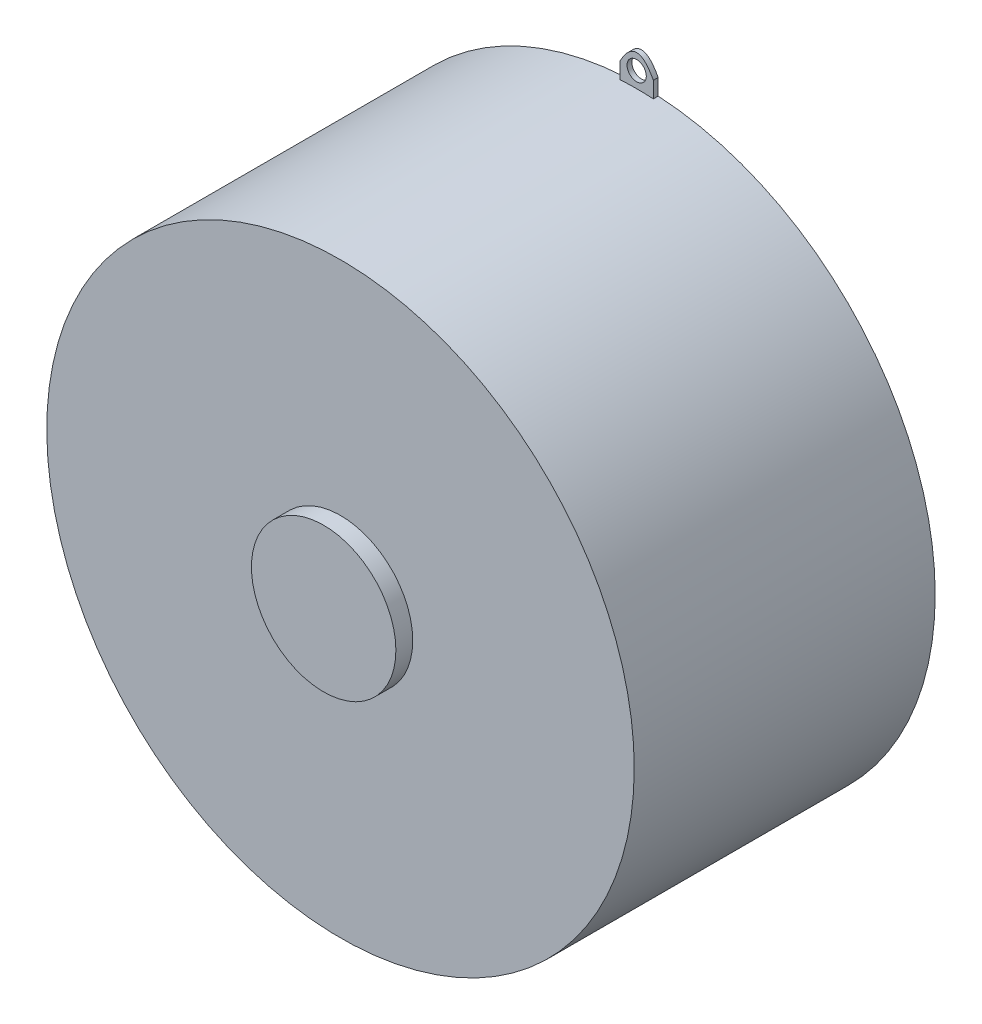
ISO-10303-21;
HEADER;
FILE_DESCRIPTION(('STEP AP214'),'2;1');
FILE_NAME('part.step','',(''),(''),'','','');
FILE_SCHEMA(('AUTOMOTIVE_DESIGN { 1 0 10303 214 1 1 1 1 }'));
ENDSEC;
DATA;
#1=APPLICATION_CONTEXT('core data for automotive mechanical design processes');
#2=APPLICATION_PROTOCOL_DEFINITION('international standard','automotive_design',2000,#1);
#3=PRODUCT_CONTEXT('',#1,'mechanical');
#4=PRODUCT('Part','Part','',(#3));
#5=PRODUCT_RELATED_PRODUCT_CATEGORY('part','',(#4));
#6=PRODUCT_DEFINITION_FORMATION('','',#4);
#7=PRODUCT_DEFINITION_CONTEXT('part definition',#1,'design');
#8=PRODUCT_DEFINITION('design','',#6,#7);
#9=PRODUCT_DEFINITION_SHAPE('','',#8);
#10=(LENGTH_UNIT() NAMED_UNIT(*) SI_UNIT(.MILLI.,.METRE.));
#11=(NAMED_UNIT(*) PLANE_ANGLE_UNIT() SI_UNIT($,.RADIAN.));
#12=(NAMED_UNIT(*) SI_UNIT($,.STERADIAN.) SOLID_ANGLE_UNIT());
#13=UNCERTAINTY_MEASURE_WITH_UNIT(LENGTH_MEASURE(1.E-05),#10,'distance_accuracy_value','');
#14=(GEOMETRIC_REPRESENTATION_CONTEXT(3) GLOBAL_UNCERTAINTY_ASSIGNED_CONTEXT((#13)) GLOBAL_UNIT_ASSIGNED_CONTEXT((#10,
#11,#12)) REPRESENTATION_CONTEXT('',''));
#15=CARTESIAN_POINT('',(0.,0.,0.));
#16=DIRECTION('',(0.,0.,1.));
#17=DIRECTION('',(1.,0.,0.));
#18=AXIS2_PLACEMENT_3D('',#15,#16,#17);
#19=CARTESIAN_POINT('',(0.,0.,-5.3));
#20=DIRECTION('',(0.,0.,1.));
#21=DIRECTION('',(1.,0.,0.));
#22=AXIS2_PLACEMENT_3D('',#19,#20,#21);
#23=CYLINDRICAL_SURFACE('',#22,1.);
#24=CARTESIAN_POINT('',(0.,0.,-5.3));
#25=DIRECTION('',(0.,0.,-1.));
#26=DIRECTION('',(-1.,0.,0.));
#27=AXIS2_PLACEMENT_3D('',#24,#25,#26);
#28=CIRCLE('',#27,1.);
#29=CARTESIAN_POINT('',(-1.,0.,-5.3));
#30=VERTEX_POINT('',#29);
#31=EDGE_CURVE('E364',#30,#30,#28,.T.);
#32=ORIENTED_EDGE('',*,*,#31,.F.);
#33=EDGE_LOOP('',(#32));
#34=FACE_BOUND('',#33,.T.);
#35=CARTESIAN_POINT('',(0.,0.,-0.5));
#36=DIRECTION('',(0.,0.,-1.));
#37=DIRECTION('',(-1.,0.,0.));
#38=AXIS2_PLACEMENT_3D('',#35,#36,#37);
#39=CIRCLE('',#38,1.);
#40=CARTESIAN_POINT('',(-1.,0.,-0.5));
#41=VERTEX_POINT('',#40);
#42=EDGE_CURVE('E343',#41,#41,#39,.T.);
#43=ORIENTED_EDGE('',*,*,#42,.T.);
#44=EDGE_LOOP('',(#43));
#45=FACE_BOUND('',#44,.T.);
#46=CARTESIAN_POINT('',(0.324436742180061,-0.945907395215615,-2.19590364640662));
#47=CARTESIAN_POINT('',(0.324434225291573,-0.945909362151226,-2.17447589168283));
#48=CARTESIAN_POINT('',(0.322648665590669,-0.946526639994775,-2.15301782994374));
#49=CARTESIAN_POINT('',(0.315578505603582,-0.948906311365887,-2.1107172627641));
#50=CARTESIAN_POINT('',(0.310284964177607,-0.950671630805546,-2.08987647279784));
#51=CARTESIAN_POINT('',(0.296449088398732,-0.955075937265124,-2.04949408259734));
#52=CARTESIAN_POINT('',(0.287918995351223,-0.957711627551271,-2.02994790907413));
#53=CARTESIAN_POINT('',(0.267910050193361,-0.963499988270369,-1.99252808333759));
#54=CARTESIAN_POINT('',(0.256431841875879,-0.966652545778463,-1.97465406712904));
#55=CARTESIAN_POINT('',(0.230176924244251,-0.973247538781266,-1.9400532632731));
#56=CARTESIAN_POINT('',(0.215260009092982,-0.976696528394831,-1.92343406477273));
#57=CARTESIAN_POINT('',(0.18288693073741,-0.983272607626951,-1.89279952432207));
#58=CARTESIAN_POINT('',(0.165429883826096,-0.986399584568711,-1.87878509244521));
#59=CARTESIAN_POINT('',(0.12765714171568,-0.992008991616168,-1.85322377374083));
#60=CARTESIAN_POINT('',(0.107255853530934,-0.994461135192959,-1.84179601272979));
#61=CARTESIAN_POINT('',(0.0647177226048224,-0.998131419742484,-1.82253580939339));
#62=CARTESIAN_POINT('',(0.0425815903498055,-0.999350063065721,-1.81470190415963));
#63=CARTESIAN_POINT('',(-0.00164276109157981,-1.00023119786886,-1.80323574112415));
#64=CARTESIAN_POINT('',(-0.0236814202658569,-0.999966168681,-1.7994184358874));
#65=CARTESIAN_POINT('',(-0.0680151973612102,-0.99793065819225,-1.795497984973));
#66=CARTESIAN_POINT('',(-0.0903102165083141,-0.996160738730243,-1.79539345378343));
#67=CARTESIAN_POINT('',(-0.133193507210785,-0.991311916278786,-1.79880007865559));
#68=CARTESIAN_POINT('',(-0.153807299261474,-0.988312132928374,-1.80210844790468));
#69=CARTESIAN_POINT('',(-0.194062868497015,-0.981202108313626,-1.81190204628088));
#70=CARTESIAN_POINT('',(-0.213704574275582,-0.977091785615516,-1.81838750840664));
#71=CARTESIAN_POINT('',(-0.25182605533489,-0.967974107852494,-1.83443077285999));
#72=CARTESIAN_POINT('',(-0.270283871832028,-0.962954173378863,-1.8440333824013));
#73=CARTESIAN_POINT('',(-0.305323894544439,-0.952424561924679,-1.86599636527846));
#74=CARTESIAN_POINT('',(-0.321905455026847,-0.946914717494576,-1.87835768372827));
#75=CARTESIAN_POINT('',(-0.353899939190523,-0.93544769479271,-1.90643300725181));
#76=CARTESIAN_POINT('',(-0.369164675150867,-0.929484896178391,-1.92231384064005));
#77=CARTESIAN_POINT('',(-0.396893970189738,-0.917987472314669,-1.95650090457785));
#78=CARTESIAN_POINT('',(-0.409357612791649,-0.91245298759048,-1.97480792583508));
#79=CARTESIAN_POINT('',(-0.431487995755532,-0.902203675514238,-2.01398615298607));
#80=CARTESIAN_POINT('',(-0.441065777171563,-0.897516420248011,-2.03491518681403));
#81=CARTESIAN_POINT('',(-0.456612609234126,-0.889708667769292,-2.07834503765161));
#82=CARTESIAN_POINT('',(-0.462584003305925,-0.886587153364646,-2.10084482336072));
#83=CARTESIAN_POINT('',(-0.470425847447674,-0.882450063793875,-2.14530888124353));
#84=CARTESIAN_POINT('',(-0.472524512329182,-0.881317499904934,-2.16722191652592));
#85=CARTESIAN_POINT('',(-0.473234044444228,-0.880936951688668,-2.21111748899978));
#86=CARTESIAN_POINT('',(-0.4718459692832,-0.881688395899855,-2.23310000309674));
#87=CARTESIAN_POINT('',(-0.465823952006189,-0.884883211085994,-2.27519433102709));
#88=CARTESIAN_POINT('',(-0.461379363269549,-0.887227790031893,-2.29534138542617));
#89=CARTESIAN_POINT('',(-0.44960301998729,-0.893252790526944,-2.33456098477123));
#90=CARTESIAN_POINT('',(-0.442270625305328,-0.89693350824214,-2.35363329040678));
#91=CARTESIAN_POINT('',(-0.424574965405367,-0.905447927778751,-2.39102442115635));
#92=CARTESIAN_POINT('',(-0.414100860022007,-0.910322329152668,-2.40928133667843));
#93=CARTESIAN_POINT('',(-0.39050372845111,-0.920691449068172,-2.44380096933211));
#94=CARTESIAN_POINT('',(-0.377379623548089,-0.926186419817572,-2.46006287002042));
#95=CARTESIAN_POINT('',(-0.347681275977476,-0.93775776188096,-2.49137923326675));
#96=CARTESIAN_POINT('',(-0.330923809489772,-0.943847099861078,-2.50625581864967));
#97=CARTESIAN_POINT('',(-0.295008246667299,-0.955681541944862,-2.53293981417677));
#98=CARTESIAN_POINT('',(-0.275850052811056,-0.961426632050595,-2.54474709958104));
#99=CARTESIAN_POINT('',(-0.235580745201013,-0.972077580290542,-2.56491366142693));
#100=CARTESIAN_POINT('',(-0.214470112903131,-0.976983644476256,-2.57327378515065));
#101=CARTESIAN_POINT('',(-0.170882142153246,-0.985541168330321,-2.58621358879627));
#102=CARTESIAN_POINT('',(-0.148405552509789,-0.989193308218302,-2.59079532028978));
#103=CARTESIAN_POINT('',(-0.104296784974277,-0.994778393762521,-2.59580459684676));
#104=CARTESIAN_POINT('',(-0.0827051860539979,-0.996807956534549,-2.59648366381623));
#105=CARTESIAN_POINT('',(-0.0396128686870716,-0.999448112601287,-2.5943325606254));
#106=CARTESIAN_POINT('',(-0.0181121369817497,-1.00005892058548,-2.5915029215106));
#107=CARTESIAN_POINT('',(0.0235023867120378,-0.999933910851502,-2.58259443777847));
#108=CARTESIAN_POINT('',(0.0436384941896606,-0.999238871927031,-2.57661804483813));
#109=CARTESIAN_POINT('',(0.08270398565154,-0.996766533367678,-2.56169336860866));
#110=CARTESIAN_POINT('',(0.101633146271985,-0.994989034045589,-2.55274453711653));
#111=CARTESIAN_POINT('',(0.138649980779317,-0.990524674477262,-2.53168341294824));
#112=CARTESIAN_POINT('',(0.15666348799326,-0.987801095406952,-2.51944878544706));
#113=CARTESIAN_POINT('',(0.190494812490118,-0.981838748533181,-2.49234630334236));
#114=CARTESIAN_POINT('',(0.206311716023672,-0.978599767526407,-2.47747735872631));
#115=CARTESIAN_POINT('',(0.236287639554858,-0.971812158647412,-2.44444081497042));
#116=CARTESIAN_POINT('',(0.250283404699097,-0.968256774845,-2.42612598996322));
#117=CARTESIAN_POINT('',(0.274977094275787,-0.961536325115072,-2.38731509960095));
#118=CARTESIAN_POINT('',(0.285674631310193,-0.958371305064458,-2.36681877839522));
#119=CARTESIAN_POINT('',(0.302575156206335,-0.95316285627702,-2.32609597293323));
#120=CARTESIAN_POINT('',(0.309095507527843,-0.951044227552477,-2.30601056474851));
#121=CARTESIAN_POINT('',(0.318805533287902,-0.947834461880353,-2.26500692145924));
#122=CARTESIAN_POINT('',(0.322004488700386,-0.946740462654865,-2.24409117751841));
#123=CARTESIAN_POINT('',(0.324119744664414,-0.946015858645798,-2.21402863185632));
#124=CARTESIAN_POINT('',(0.324437806972435,-0.945906563085765,-2.20496885129011));
#125=CARTESIAN_POINT('',(0.324436742180061,-0.945907395215615,-2.19590364640662));
#126=B_SPLINE_CURVE_WITH_KNOTS('',3,(#46,#47,#48,#49,#50,#51,#52,#53,#54,#55,#56,#57,#58,#59,
#60,#61,#62,#63,#64,#65,#66,#67,#68,#69,#70,#71,#72,#73,#74,#75,#76,#77,#78,#79,#80,#81,#82,#83,
#84,#85,#86,#87,#88,#89,#90,#91,#92,#93,#94,#95,#96,#97,#98,#99,#100,#101,#102,#103,#104,#105,
#106,#107,#108,#109,#110,#111,#112,#113,#114,#115,#116,#117,#118,#119,#120,#121,#122,#123,#124,
#125),.UNSPECIFIED.,.T.,.F.,(4,2,2,2,2,2,2,2,2,2,2,2,2,2,2,2,2,2,2,2,2,2,2,2,2,2,2,2,2,2,2,2,2,
2,2,2,2,2,2,4),(0.,0.064255093801459,0.128674594066265,0.192852836762955,0.257017076473185,
0.324509353174941,0.392025166701806,0.462203921075704,0.532354083210266,0.599108181056326,
0.665837367725471,0.728817941550643,0.791803134877486,0.855737075605713,0.919692953361314,
0.987847562673598,1.05602443881418,1.12612730570592,1.19618457070729,1.26196259191828,
1.32772066360885,1.38973382647279,1.4517607434612,1.51630272565158,1.58087103362173,
1.65020803938491,1.71954786264432,1.7888706326094,1.85815573723058,1.92292060734514,
1.98767567644063,2.0504421186552,2.11322014323702,2.17877276163733,2.24435256763983,
2.31399226519831,2.38364013927254,2.44703313864727,2.51024851834461,2.537432215266),.UNSPECIFIED.);
#127=CARTESIAN_POINT('',(0.324436742180061,-0.945907395215615,-2.19590364640662));
#128=VERTEX_POINT('',#127);
#129=EDGE_CURVE('E41',#128,#128,#126,.T.);
#130=ORIENTED_EDGE('',*,*,#129,.F.);
#131=EDGE_LOOP('',(#130));
#132=FACE_BOUND('',#131,.T.);
#133=ADVANCED_FACE('F37',(#34,#45,#132),#23,.T.);
#134=CARTESIAN_POINT('',(0.,0.,12.5));
#135=DIRECTION('',(0.,0.,-1.));
#136=DIRECTION('',(-1.,0.,0.));
#137=AXIS2_PLACEMENT_3D('',#134,#135,#136);
#138=CYLINDRICAL_SURFACE('',#137,12.2);
#139=CARTESIAN_POINT('',(0.,0.,12.5));
#140=DIRECTION('',(0.,0.,1.));
#141=DIRECTION('',(1.,0.,0.));
#142=AXIS2_PLACEMENT_3D('',#139,#140,#141);
#143=CIRCLE('',#142,12.2);
#144=CARTESIAN_POINT('',(12.2,0.,12.5));
#145=VERTEX_POINT('',#144);
#146=EDGE_CURVE('E393',#145,#145,#143,.T.);
#147=ORIENTED_EDGE('',*,*,#146,.F.);
#148=EDGE_LOOP('',(#147));
#149=FACE_BOUND('',#148,.T.);
#150=DIRECTION('',(0.,0.,-1.));
#151=VECTOR('',#150,1.);
#152=CARTESIAN_POINT('',(0.694469448137106,-12.1802180680645,0.2));
#153=LINE('',#152,#151);
#154=CARTESIAN_POINT('',(0.694469448137106,-12.1802180680645,0.200000000000001));
#155=VERTEX_POINT('',#154);
#156=CARTESIAN_POINT('',(0.694469448137106,-12.1802180680645,0.));
#157=VERTEX_POINT('',#156);
#158=EDGE_CURVE('E157',#155,#157,#153,.T.);
#159=ORIENTED_EDGE('',*,*,#158,.T.);
#160=CARTESIAN_POINT('',(0.,0.,0.));
#161=DIRECTION('',(0.,0.,1.));
#162=DIRECTION('',(1.,0.,0.));
#163=AXIS2_PLACEMENT_3D('',#160,#161,#162);
#164=CIRCLE('',#163,12.2);
#165=CARTESIAN_POINT('',(0.694469448137106,12.1802180680645,0.));
#166=VERTEX_POINT('',#165);
#167=EDGE_CURVE('E390',#157,#166,#164,.T.);
#168=ORIENTED_EDGE('',*,*,#167,.T.);
#169=DIRECTION('',(0.,0.,-1.));
#170=VECTOR('',#169,1.);
#171=CARTESIAN_POINT('',(0.694469448137106,12.1802180680645,0.2));
#172=LINE('',#171,#170);
#173=CARTESIAN_POINT('',(0.694469448137106,12.1802180680645,0.200000000000001));
#174=VERTEX_POINT('',#173);
#175=EDGE_CURVE('E344',#174,#166,#172,.T.);
#176=ORIENTED_EDGE('',*,*,#175,.F.);
#177=CARTESIAN_POINT('',(0.,0.,0.2));
#178=DIRECTION('',(0.,0.,-1.));
#179=DIRECTION('',(-1.,0.,0.));
#180=AXIS2_PLACEMENT_3D('',#177,#178,#179);
#181=CIRCLE('',#180,12.2);
#182=CARTESIAN_POINT('',(-0.694469448136626,12.1802180680645,0.200000000000001));
#183=VERTEX_POINT('',#182);
#184=EDGE_CURVE('E338',#183,#174,#181,.T.);
#185=ORIENTED_EDGE('',*,*,#184,.F.);
#186=DIRECTION('',(0.,0.,-1.));
#187=VECTOR('',#186,1.);
#188=CARTESIAN_POINT('',(-0.694469448136626,12.1802180680645,0.2));
#189=LINE('',#188,#187);
#190=CARTESIAN_POINT('',(-0.694469448136626,12.1802180680645,0.));
#191=VERTEX_POINT('',#190);
#192=EDGE_CURVE('E341',#183,#191,#189,.T.);
#193=ORIENTED_EDGE('',*,*,#192,.T.);
#194=CARTESIAN_POINT('',(-0.694469448136626,-12.1802180680645,0.));
#195=VERTEX_POINT('',#194);
#196=EDGE_CURVE('E303',#191,#195,#164,.T.);
#197=ORIENTED_EDGE('',*,*,#196,.T.);
#198=DIRECTION('',(0.,0.,-1.));
#199=VECTOR('',#198,1.);
#200=CARTESIAN_POINT('',(-0.694469448136626,-12.1802180680645,0.2));
#201=LINE('',#200,#199);
#202=CARTESIAN_POINT('',(-0.694469448136626,-12.1802180680645,0.200000000000001));
#203=VERTEX_POINT('',#202);
#204=EDGE_CURVE('E59',#203,#195,#201,.T.);
#205=ORIENTED_EDGE('',*,*,#204,.F.);
#206=CARTESIAN_POINT('',(0.,0.,0.2));
#207=DIRECTION('',(0.,0.,-1.));
#208=DIRECTION('',(-1.,0.,0.));
#209=AXIS2_PLACEMENT_3D('',#206,#207,#208);
#210=CIRCLE('',#209,12.2);
#211=EDGE_CURVE('E63',#155,#203,#210,.T.);
#212=ORIENTED_EDGE('',*,*,#211,.F.);
#213=EDGE_LOOP('',(#159,#168,#176,#185,#193,#197,#205,#212));
#214=FACE_BOUND('',#213,.T.);
#215=ADVANCED_FACE('F39',(#149,#214),#138,.T.);
#216=CARTESIAN_POINT('',(0.,0.,-1.));
#217=DIRECTION('',(0.,0.,1.));
#218=DIRECTION('',(1.,0.,0.));
#219=AXIS2_PLACEMENT_3D('',#216,#217,#218);
#220=CYLINDRICAL_SURFACE('',#219,3.25);
#221=CARTESIAN_POINT('',(0.,0.,0.));
#222=DIRECTION('',(0.,0.,-1.));
#223=DIRECTION('',(-1.,0.,0.));
#224=AXIS2_PLACEMENT_3D('',#221,#222,#223);
#225=CIRCLE('',#224,3.25);
#226=CARTESIAN_POINT('',(-3.25,0.,0.));
#227=VERTEX_POINT('',#226);
#228=EDGE_CURVE('E11',#227,#227,#225,.T.);
#229=ORIENTED_EDGE('',*,*,#228,.T.);
#230=EDGE_LOOP('',(#229));
#231=FACE_BOUND('',#230,.T.);
#232=CARTESIAN_POINT('',(0.,0.,-0.5));
#233=DIRECTION('',(0.,0.,-1.));
#234=DIRECTION('',(-1.,0.,0.));
#235=AXIS2_PLACEMENT_3D('',#232,#233,#234);
#236=CIRCLE('',#235,3.25);
#237=CARTESIAN_POINT('',(-3.25,0.,-0.5));
#238=VERTEX_POINT('',#237);
#239=EDGE_CURVE('E347',#238,#238,#236,.T.);
#240=ORIENTED_EDGE('',*,*,#239,.F.);
#241=EDGE_LOOP('',(#240));
#242=FACE_BOUND('',#241,.T.);
#243=ADVANCED_FACE('F255',(#231,#242),#220,.T.);
#244=CARTESIAN_POINT('',(0.,0.,12.5));
#245=DIRECTION('',(0.,0.,1.));
#246=DIRECTION('',(1.,0.,0.));
#247=AXIS2_PLACEMENT_3D('',#244,#245,#246);
#248=PLANE('',#247);
#249=CARTESIAN_POINT('',(0.,0.,12.5));
#250=DIRECTION('',(0.,0.,1.));
#251=DIRECTION('',(1.,0.,0.));
#252=AXIS2_PLACEMENT_3D('',#249,#250,#251);
#253=CIRCLE('',#252,3.);
#254=CARTESIAN_POINT('',(3.,0.,12.5));
#255=VERTEX_POINT('',#254);
#256=EDGE_CURVE('E51',#255,#255,#253,.T.);
#257=ORIENTED_EDGE('',*,*,#256,.F.);
#258=EDGE_LOOP('',(#257));
#259=FACE_BOUND('',#258,.T.);
#260=ORIENTED_EDGE('',*,*,#146,.T.);
#261=EDGE_LOOP('',(#260));
#262=FACE_BOUND('',#261,.T.);
#263=ADVANCED_FACE('F258',(#259,#262),#248,.T.);
#264=CARTESIAN_POINT('',(0.,0.,0.));
#265=DIRECTION('',(0.,0.,1.));
#266=DIRECTION('',(1.,0.,0.));
#267=AXIS2_PLACEMENT_3D('',#264,#265,#266);
#268=PLANE('',#267);
#269=CARTESIAN_POINT('',(0.,8.25,0.));
#270=DIRECTION('',(0.,0.,-1.));
#271=DIRECTION('',(-1.,0.,0.));
#272=AXIS2_PLACEMENT_3D('',#269,#270,#271);
#273=CIRCLE('',#272,0.85);
#274=CARTESIAN_POINT('',(-0.85,8.25,0.));
#275=VERTEX_POINT('',#274);
#276=EDGE_CURVE('E278',#275,#275,#273,.T.);
#277=ORIENTED_EDGE('',*,*,#276,.F.);
#278=EDGE_LOOP('',(#277));
#279=FACE_BOUND('',#278,.T.);
#280=CARTESIAN_POINT('',(-7.14470958122185,4.12500000000041,0.));
#281=DIRECTION('',(0.,0.,-1.));
#282=DIRECTION('',(-1.,0.,0.));
#283=AXIS2_PLACEMENT_3D('',#280,#281,#282);
#284=CIRCLE('',#283,0.850000000000126);
#285=CARTESIAN_POINT('',(-7.99470958122198,4.12500000000041,0.));
#286=VERTEX_POINT('',#285);
#287=EDGE_CURVE('E282',#286,#286,#284,.T.);
#288=ORIENTED_EDGE('',*,*,#287,.F.);
#289=EDGE_LOOP('',(#288));
#290=FACE_BOUND('',#289,.T.);
#291=CARTESIAN_POINT('',(-7.14470958122232,-4.12499999999959,0.));
#292=DIRECTION('',(0.,0.,-1.));
#293=DIRECTION('',(-1.,0.,0.));
#294=AXIS2_PLACEMENT_3D('',#291,#292,#293);
#295=CIRCLE('',#294,0.850000000000591);
#296=CARTESIAN_POINT('',(-7.99470958122291,-4.12499999999959,0.));
#297=VERTEX_POINT('',#296);
#298=EDGE_CURVE('E286',#297,#297,#295,.T.);
#299=ORIENTED_EDGE('',*,*,#298,.F.);
#300=EDGE_LOOP('',(#299));
#301=FACE_BOUND('',#300,.T.);
#302=CARTESIAN_POINT('',(-9.35895743984739E-13,-8.25,0.));
#303=DIRECTION('',(0.,0.,-1.));
#304=DIRECTION('',(-1.,0.,0.));
#305=AXIS2_PLACEMENT_3D('',#302,#303,#304);
#306=CIRCLE('',#305,0.85000000000095);
#307=CARTESIAN_POINT('',(-0.850000000001886,-8.25,0.));
#308=VERTEX_POINT('',#307);
#309=EDGE_CURVE('E290',#308,#308,#306,.T.);
#310=ORIENTED_EDGE('',*,*,#309,.F.);
#311=EDGE_LOOP('',(#310));
#312=FACE_BOUND('',#311,.T.);
#313=CARTESIAN_POINT('',(7.14470958122092,-4.12500000000041,0.));
#314=DIRECTION('',(0.,0.,-1.));
#315=DIRECTION('',(-1.,0.,0.));
#316=AXIS2_PLACEMENT_3D('',#313,#314,#315);
#317=CIRCLE('',#316,0.850000000000865);
#318=CARTESIAN_POINT('',(6.29470958122005,-4.12500000000041,0.));
#319=VERTEX_POINT('',#318);
#320=EDGE_CURVE('E294',#319,#319,#317,.T.);
#321=ORIENTED_EDGE('',*,*,#320,.F.);
#322=EDGE_LOOP('',(#321));
#323=FACE_BOUND('',#322,.T.);
#324=CARTESIAN_POINT('',(7.14470958122139,4.12499999999959,0.));
#325=DIRECTION('',(0.,0.,-1.));
#326=DIRECTION('',(-1.,0.,0.));
#327=AXIS2_PLACEMENT_3D('',#324,#325,#326);
#328=CIRCLE('',#327,0.85000000000044);
#329=CARTESIAN_POINT('',(6.29470958122095,4.12499999999959,0.));
#330=VERTEX_POINT('',#329);
#331=EDGE_CURVE('E298',#330,#330,#328,.T.);
#332=ORIENTED_EDGE('',*,*,#331,.F.);
#333=EDGE_LOOP('',(#332));
#334=FACE_BOUND('',#333,.T.);
#335=ORIENTED_EDGE('',*,*,#228,.F.);
#336=EDGE_LOOP('',(#335));
#337=FACE_BOUND('',#336,.T.);
#338=ORIENTED_EDGE('',*,*,#196,.F.);
#339=DIRECTION('',(0.,-1.,0.));
#340=VECTOR('',#339,1.);
#341=CARTESIAN_POINT('',(-0.694469448136626,0.,0.));
#342=LINE('',#341,#340);
#343=CARTESIAN_POINT('',(-0.694469448136626,12.849999999997,0.));
#344=VERTEX_POINT('',#343);
#345=EDGE_CURVE('E342',#344,#191,#342,.T.);
#346=ORIENTED_EDGE('',*,*,#345,.F.);
#347=CARTESIAN_POINT('',(-0.694469448136626,12.849999999997,0.));
#348=CARTESIAN_POINT('',(2.402863064771E-13,14.149999999997,0.));
#349=CARTESIAN_POINT('',(0.694469448137106,12.849999999997,0.));
#350=B_SPLINE_CURVE_WITH_KNOTS('',2,(#347,#348,#349),.UNSPECIFIED.,.F.,.F.,(3,3),(0.,1.),.UNSPECIFIED.);
#351=CARTESIAN_POINT('',(0.694469448137106,12.849999999997,0.));
#352=VERTEX_POINT('',#351);
#353=EDGE_CURVE('E401',#344,#352,#350,.T.);
#354=ORIENTED_EDGE('',*,*,#353,.T.);
#355=DIRECTION('',(0.,-1.,0.));
#356=VECTOR('',#355,1.);
#357=CARTESIAN_POINT('',(0.694469448137106,0.,0.));
#358=LINE('',#357,#356);
#359=EDGE_CURVE('E164',#352,#166,#358,.T.);
#360=ORIENTED_EDGE('',*,*,#359,.T.);
#361=ORIENTED_EDGE('',*,*,#167,.F.);
#362=DIRECTION('',(0.,1.,0.));
#363=VECTOR('',#362,1.);
#364=CARTESIAN_POINT('',(0.694469448137106,0.,0.));
#365=LINE('',#364,#363);
#366=CARTESIAN_POINT('',(0.694469448137106,-12.849999999997,0.));
#367=VERTEX_POINT('',#366);
#368=EDGE_CURVE('E150',#367,#157,#365,.T.);
#369=ORIENTED_EDGE('',*,*,#368,.F.);
#370=CARTESIAN_POINT('',(-0.694469448136626,-12.849999999997,0.));
#371=CARTESIAN_POINT('',(2.40272753949944E-13,-14.149999999997,0.));
#372=CARTESIAN_POINT('',(0.694469448137106,-12.849999999997,0.));
#373=B_SPLINE_CURVE_WITH_KNOTS('',2,(#370,#371,#372),.UNSPECIFIED.,.F.,.F.,(3,3),(0.,1.),.UNSPECIFIED.);
#374=CARTESIAN_POINT('',(-0.694469448136626,-12.849999999997,0.));
#375=VERTEX_POINT('',#374);
#376=EDGE_CURVE('E142',#375,#367,#373,.T.);
#377=ORIENTED_EDGE('',*,*,#376,.F.);
#378=DIRECTION('',(0.,1.,0.));
#379=VECTOR('',#378,1.);
#380=CARTESIAN_POINT('',(-0.694469448136626,0.,0.));
#381=LINE('',#380,#379);
#382=EDGE_CURVE('E114',#375,#195,#381,.T.);
#383=ORIENTED_EDGE('',*,*,#382,.T.);
#384=EDGE_LOOP('',(#338,#346,#354,#360,#361,#369,#377,#383));
#385=FACE_BOUND('',#384,.T.);
#386=CARTESIAN_POINT('',(2.40259201422788E-13,12.849999999997,0.));
#387=DIRECTION('',(0.,0.,-1.));
#388=DIRECTION('',(-1.,0.,0.));
#389=AXIS2_PLACEMENT_3D('',#386,#387,#388);
#390=CIRCLE('',#389,0.4);
#391=CARTESIAN_POINT('',(-0.399999999999759,12.849999999997,0.));
#392=VERTEX_POINT('',#391);
#393=EDGE_CURVE('E156',#392,#392,#390,.T.);
#394=ORIENTED_EDGE('',*,*,#393,.F.);
#395=EDGE_LOOP('',(#394));
#396=FACE_BOUND('',#395,.T.);
#397=CARTESIAN_POINT('',(2.40259201422788E-13,-12.849999999997,0.));
#398=DIRECTION('',(0.,0.,-1.));
#399=DIRECTION('',(-1.,0.,0.));
#400=AXIS2_PLACEMENT_3D('',#397,#398,#399);
#401=CIRCLE('',#400,0.4);
#402=CARTESIAN_POINT('',(-0.399999999999759,-12.849999999997,0.));
#403=VERTEX_POINT('',#402);
#404=EDGE_CURVE('E127',#403,#403,#401,.F.);
#405=ORIENTED_EDGE('',*,*,#404,.T.);
#406=EDGE_LOOP('',(#405));
#407=FACE_BOUND('',#406,.T.);
#408=ADVANCED_FACE('F266',(#279,#290,#301,#312,#323,#334,#337,#385,#396,#407),#268,.F.);
#409=CARTESIAN_POINT('',(0.,0.,13.2));
#410=DIRECTION('',(0.,0.,-1.));
#411=DIRECTION('',(-1.,0.,0.));
#412=AXIS2_PLACEMENT_3D('',#409,#410,#411);
#413=CYLINDRICAL_SURFACE('',#412,3.);
#414=CARTESIAN_POINT('',(0.,0.,13.2));
#415=DIRECTION('',(0.,0.,1.));
#416=DIRECTION('',(1.,0.,0.));
#417=AXIS2_PLACEMENT_3D('',#414,#415,#416);
#418=CIRCLE('',#417,3.);
#419=CARTESIAN_POINT('',(3.,0.,13.2));
#420=VERTEX_POINT('',#419);
#421=EDGE_CURVE('E386',#420,#420,#418,.T.);
#422=ORIENTED_EDGE('',*,*,#421,.F.);
#423=EDGE_LOOP('',(#422));
#424=FACE_BOUND('',#423,.T.);
#425=ORIENTED_EDGE('',*,*,#256,.T.);
#426=EDGE_LOOP('',(#425));
#427=FACE_BOUND('',#426,.T.);
#428=ADVANCED_FACE('F262',(#424,#427),#413,.T.);
#429=CARTESIAN_POINT('',(0.,0.,13.2));
#430=DIRECTION('',(0.,0.,1.));
#431=DIRECTION('',(1.,0.,0.));
#432=AXIS2_PLACEMENT_3D('',#429,#430,#431);
#433=PLANE('',#432);
#434=ORIENTED_EDGE('',*,*,#421,.T.);
#435=EDGE_LOOP('',(#434));
#436=FACE_BOUND('',#435,.T.);
#437=ADVANCED_FACE('F221',(#436),#433,.T.);
#438=CARTESIAN_POINT('',(7.14470958122139,4.12499999999959,0.35));
#439=DIRECTION('',(0.,0.,-1.));
#440=DIRECTION('',(-1.,0.,0.));
#441=AXIS2_PLACEMENT_3D('',#438,#439,#440);
#442=CYLINDRICAL_SURFACE('',#441,0.85000000000044);
#443=CARTESIAN_POINT('',(7.14470958122139,4.12499999999959,0.35));
#444=DIRECTION('',(0.,0.,-1.));
#445=DIRECTION('',(-1.,0.,0.));
#446=AXIS2_PLACEMENT_3D('',#443,#444,#445);
#447=CIRCLE('',#446,0.85000000000044);
#448=CARTESIAN_POINT('',(6.29470958122095,4.12499999999959,0.35));
#449=VERTEX_POINT('',#448);
#450=EDGE_CURVE('E371',#449,#449,#447,.T.);
#451=ORIENTED_EDGE('',*,*,#450,.F.);
#452=EDGE_LOOP('',(#451));
#453=FACE_BOUND('',#452,.T.);
#454=ORIENTED_EDGE('',*,*,#331,.T.);
#455=EDGE_LOOP('',(#454));
#456=FACE_BOUND('',#455,.T.);
#457=ADVANCED_FACE('F217',(#453,#456),#442,.F.);
#458=CARTESIAN_POINT('',(7.14470958122139,4.12499999999959,0.35));
#459=DIRECTION('',(0.,0.,-1.));
#460=DIRECTION('',(-1.,0.,0.));
#461=AXIS2_PLACEMENT_3D('',#458,#459,#460);
#462=PLANE('',#461);
#463=ORIENTED_EDGE('',*,*,#450,.T.);
#464=EDGE_LOOP('',(#463));
#465=FACE_BOUND('',#464,.T.);
#466=ADVANCED_FACE('F220',(#465),#462,.T.);
#467=CARTESIAN_POINT('',(7.14470958122092,-4.12500000000041,0.35));
#468=DIRECTION('',(0.,0.,-1.));
#469=DIRECTION('',(-1.,0.,0.));
#470=AXIS2_PLACEMENT_3D('',#467,#468,#469);
#471=CYLINDRICAL_SURFACE('',#470,0.850000000000865);
#472=CARTESIAN_POINT('',(7.14470958122092,-4.12500000000041,0.35));
#473=DIRECTION('',(0.,0.,-1.));
#474=DIRECTION('',(-1.,0.,0.));
#475=AXIS2_PLACEMENT_3D('',#472,#473,#474);
#476=CIRCLE('',#475,0.850000000000865);
#477=CARTESIAN_POINT('',(6.29470958122005,-4.12500000000041,0.35));
#478=VERTEX_POINT('',#477);
#479=EDGE_CURVE('E375',#478,#478,#476,.T.);
#480=ORIENTED_EDGE('',*,*,#479,.F.);
#481=EDGE_LOOP('',(#480));
#482=FACE_BOUND('',#481,.T.);
#483=ORIENTED_EDGE('',*,*,#320,.T.);
#484=EDGE_LOOP('',(#483));
#485=FACE_BOUND('',#484,.T.);
#486=ADVANCED_FACE('F225',(#482,#485),#471,.F.);
#487=CARTESIAN_POINT('',(7.14470958122092,-4.12500000000041,0.35));
#488=DIRECTION('',(0.,0.,-1.));
#489=DIRECTION('',(-1.,0.,0.));
#490=AXIS2_PLACEMENT_3D('',#487,#488,#489);
#491=PLANE('',#490);
#492=ORIENTED_EDGE('',*,*,#479,.T.);
#493=EDGE_LOOP('',(#492));
#494=FACE_BOUND('',#493,.T.);
#495=ADVANCED_FACE('F229',(#494),#491,.T.);
#496=CARTESIAN_POINT('',(-9.35895743984739E-13,-8.25,0.35));
#497=DIRECTION('',(0.,0.,-1.));
#498=DIRECTION('',(-1.,0.,0.));
#499=AXIS2_PLACEMENT_3D('',#496,#497,#498);
#500=CYLINDRICAL_SURFACE('',#499,0.85000000000095);
#501=CARTESIAN_POINT('',(-9.35895743984739E-13,-8.25,0.35));
#502=DIRECTION('',(0.,0.,-1.));
#503=DIRECTION('',(-1.,0.,0.));
#504=AXIS2_PLACEMENT_3D('',#501,#502,#503);
#505=CIRCLE('',#504,0.85000000000095);
#506=CARTESIAN_POINT('',(-0.850000000001886,-8.25,0.35));
#507=VERTEX_POINT('',#506);
#508=EDGE_CURVE('E379',#507,#507,#505,.T.);
#509=ORIENTED_EDGE('',*,*,#508,.F.);
#510=EDGE_LOOP('',(#509));
#511=FACE_BOUND('',#510,.T.);
#512=ORIENTED_EDGE('',*,*,#309,.T.);
#513=EDGE_LOOP('',(#512));
#514=FACE_BOUND('',#513,.T.);
#515=ADVANCED_FACE('F233',(#511,#514),#500,.F.);
#516=CARTESIAN_POINT('',(-9.35895743984739E-13,-8.25,0.35));
#517=DIRECTION('',(0.,0.,-1.));
#518=DIRECTION('',(-1.,0.,0.));
#519=AXIS2_PLACEMENT_3D('',#516,#517,#518);
#520=PLANE('',#519);
#521=ORIENTED_EDGE('',*,*,#508,.T.);
#522=EDGE_LOOP('',(#521));
#523=FACE_BOUND('',#522,.T.);
#524=ADVANCED_FACE('F237',(#523),#520,.T.);
#525=CARTESIAN_POINT('',(-7.14470958122232,-4.12499999999959,0.35));
#526=DIRECTION('',(0.,0.,-1.));
#527=DIRECTION('',(-1.,0.,0.));
#528=AXIS2_PLACEMENT_3D('',#525,#526,#527);
#529=CYLINDRICAL_SURFACE('',#528,0.850000000000591);
#530=CARTESIAN_POINT('',(-7.14470958122232,-4.12499999999959,0.35));
#531=DIRECTION('',(0.,0.,-1.));
#532=DIRECTION('',(-1.,0.,0.));
#533=AXIS2_PLACEMENT_3D('',#530,#531,#532);
#534=CIRCLE('',#533,0.850000000000591);
#535=CARTESIAN_POINT('',(-7.99470958122291,-4.12499999999959,0.35));
#536=VERTEX_POINT('',#535);
#537=EDGE_CURVE('E367',#536,#536,#534,.T.);
#538=ORIENTED_EDGE('',*,*,#537,.F.);
#539=EDGE_LOOP('',(#538));
#540=FACE_BOUND('',#539,.T.);
#541=ORIENTED_EDGE('',*,*,#298,.T.);
#542=EDGE_LOOP('',(#541));
#543=FACE_BOUND('',#542,.T.);
#544=ADVANCED_FACE('F241',(#540,#543),#529,.F.);
#545=CARTESIAN_POINT('',(-7.14470958122232,-4.12499999999959,0.35));
#546=DIRECTION('',(0.,0.,-1.));
#547=DIRECTION('',(-1.,0.,0.));
#548=AXIS2_PLACEMENT_3D('',#545,#546,#547);
#549=PLANE('',#548);
#550=ORIENTED_EDGE('',*,*,#537,.T.);
#551=EDGE_LOOP('',(#550));
#552=FACE_BOUND('',#551,.T.);
#553=ADVANCED_FACE('F212',(#552),#549,.T.);
#554=CARTESIAN_POINT('',(-7.14470958122185,4.12500000000041,0.35));
#555=DIRECTION('',(0.,0.,-1.));
#556=DIRECTION('',(-1.,0.,0.));
#557=AXIS2_PLACEMENT_3D('',#554,#555,#556);
#558=CYLINDRICAL_SURFACE('',#557,0.850000000000126);
#559=CARTESIAN_POINT('',(-7.14470958122185,4.12500000000041,0.35));
#560=DIRECTION('',(0.,0.,-1.));
#561=DIRECTION('',(-1.,0.,0.));
#562=AXIS2_PLACEMENT_3D('',#559,#560,#561);
#563=CIRCLE('',#562,0.850000000000126);
#564=CARTESIAN_POINT('',(-7.99470958122198,4.12500000000041,0.35));
#565=VERTEX_POINT('',#564);
#566=EDGE_CURVE('E360',#565,#565,#563,.T.);
#567=ORIENTED_EDGE('',*,*,#566,.F.);
#568=EDGE_LOOP('',(#567));
#569=FACE_BOUND('',#568,.T.);
#570=ORIENTED_EDGE('',*,*,#287,.T.);
#571=EDGE_LOOP('',(#570));
#572=FACE_BOUND('',#571,.T.);
#573=ADVANCED_FACE('F209',(#569,#572),#558,.F.);
#574=CARTESIAN_POINT('',(-7.14470958122185,4.12500000000041,0.35));
#575=DIRECTION('',(0.,0.,-1.));
#576=DIRECTION('',(-1.,0.,0.));
#577=AXIS2_PLACEMENT_3D('',#574,#575,#576);
#578=PLANE('',#577);
#579=ORIENTED_EDGE('',*,*,#566,.T.);
#580=EDGE_LOOP('',(#579));
#581=FACE_BOUND('',#580,.T.);
#582=ADVANCED_FACE('F207',(#581),#578,.T.);
#583=CARTESIAN_POINT('',(0.,8.25,0.35));
#584=DIRECTION('',(0.,0.,-1.));
#585=DIRECTION('',(-1.,0.,0.));
#586=AXIS2_PLACEMENT_3D('',#583,#584,#585);
#587=CYLINDRICAL_SURFACE('',#586,0.85);
#588=CARTESIAN_POINT('',(0.,8.25,0.35));
#589=DIRECTION('',(0.,0.,-1.));
#590=DIRECTION('',(-1.,0.,0.));
#591=AXIS2_PLACEMENT_3D('',#588,#589,#590);
#592=CIRCLE('',#591,0.85);
#593=CARTESIAN_POINT('',(-0.85,8.25,0.35));
#594=VERTEX_POINT('',#593);
#595=EDGE_CURVE('E361',#594,#594,#592,.T.);
#596=ORIENTED_EDGE('',*,*,#595,.F.);
#597=EDGE_LOOP('',(#596));
#598=FACE_BOUND('',#597,.T.);
#599=ORIENTED_EDGE('',*,*,#276,.T.);
#600=EDGE_LOOP('',(#599));
#601=FACE_BOUND('',#600,.T.);
#602=ADVANCED_FACE('F203',(#598,#601),#587,.F.);
#603=CARTESIAN_POINT('',(0.,8.25,0.35));
#604=DIRECTION('',(0.,0.,-1.));
#605=DIRECTION('',(-1.,0.,0.));
#606=AXIS2_PLACEMENT_3D('',#603,#604,#605);
#607=PLANE('',#606);
#608=ORIENTED_EDGE('',*,*,#595,.T.);
#609=EDGE_LOOP('',(#608));
#610=FACE_BOUND('',#609,.T.);
#611=ADVANCED_FACE('F199',(#610),#607,.T.);
#612=CARTESIAN_POINT('',(0.,0.,-0.5));
#613=DIRECTION('',(0.,0.,-1.));
#614=DIRECTION('',(-1.,0.,0.));
#615=AXIS2_PLACEMENT_3D('',#612,#613,#614);
#616=PLANE('',#615);
#617=ORIENTED_EDGE('',*,*,#42,.F.);
#618=EDGE_LOOP('',(#617));
#619=FACE_BOUND('',#618,.T.);
#620=ORIENTED_EDGE('',*,*,#239,.T.);
#621=EDGE_LOOP('',(#620));
#622=FACE_BOUND('',#621,.T.);
#623=ADVANCED_FACE('F196',(#619,#622),#616,.T.);
#624=CARTESIAN_POINT('',(0.,0.,-5.3));
#625=DIRECTION('',(0.,0.,-1.));
#626=DIRECTION('',(-1.,0.,0.));
#627=AXIS2_PLACEMENT_3D('',#624,#625,#626);
#628=PLANE('',#627);
#629=ORIENTED_EDGE('',*,*,#31,.T.);
#630=EDGE_LOOP('',(#629));
#631=FACE_BOUND('',#630,.T.);
#632=ADVANCED_FACE('F191',(#631),#628,.T.);
#633=CARTESIAN_POINT('',(-0.694469448136626,0.,0.2));
#634=DIRECTION('',(1.,0.,0.));
#635=DIRECTION('',(0.,0.,-1.));
#636=AXIS2_PLACEMENT_3D('',#633,#634,#635);
#637=PLANE('',#636);
#638=ORIENTED_EDGE('',*,*,#345,.T.);
#639=ORIENTED_EDGE('',*,*,#192,.F.);
#640=DIRECTION('',(0.,-1.,0.));
#641=VECTOR('',#640,1.);
#642=CARTESIAN_POINT('',(-0.694469448136626,0.,0.2));
#643=LINE('',#642,#641);
#644=CARTESIAN_POINT('',(-0.694469448136626,12.849999999997,0.2));
#645=VERTEX_POINT('',#644);
#646=EDGE_CURVE('E163',#645,#183,#643,.T.);
#647=ORIENTED_EDGE('',*,*,#646,.F.);
#648=DIRECTION('',(0.,0.,-1.));
#649=VECTOR('',#648,1.);
#650=CARTESIAN_POINT('',(-0.694469448136626,12.849999999997,0.2));
#651=LINE('',#650,#649);
#652=EDGE_CURVE('E356',#645,#344,#651,.T.);
#653=ORIENTED_EDGE('',*,*,#652,.T.);
#654=EDGE_LOOP('',(#638,#639,#647,#653));
#655=FACE_BOUND('',#654,.T.);
#656=ADVANCED_FACE('F188',(#655),#637,.F.);
#657=CARTESIAN_POINT('',(0.694469448137106,0.,0.2));
#658=DIRECTION('',(1.,0.,0.));
#659=DIRECTION('',(0.,0.,-1.));
#660=AXIS2_PLACEMENT_3D('',#657,#658,#659);
#661=PLANE('',#660);
#662=ORIENTED_EDGE('',*,*,#359,.F.);
#663=DIRECTION('',(0.,0.,-1.));
#664=VECTOR('',#663,1.);
#665=CARTESIAN_POINT('',(0.694469448137106,12.849999999997,0.2));
#666=LINE('',#665,#664);
#667=CARTESIAN_POINT('',(0.694469448137106,12.849999999997,0.2));
#668=VERTEX_POINT('',#667);
#669=EDGE_CURVE('E350',#668,#352,#666,.T.);
#670=ORIENTED_EDGE('',*,*,#669,.F.);
#671=DIRECTION('',(0.,-1.,0.));
#672=VECTOR('',#671,1.);
#673=CARTESIAN_POINT('',(0.694469448137106,0.,0.2));
#674=LINE('',#673,#672);
#675=EDGE_CURVE('E173',#668,#174,#674,.T.);
#676=ORIENTED_EDGE('',*,*,#675,.T.);
#677=ORIENTED_EDGE('',*,*,#175,.T.);
#678=EDGE_LOOP('',(#662,#670,#676,#677));
#679=FACE_BOUND('',#678,.T.);
#680=ADVANCED_FACE('F186',(#679),#661,.T.);
#681=CARTESIAN_POINT('',(2.40259201422788E-13,12.849999999997,0.2));
#682=DIRECTION('',(0.,0.,-1.));
#683=DIRECTION('',(-1.,0.,0.));
#684=AXIS2_PLACEMENT_3D('',#681,#682,#683);
#685=CYLINDRICAL_SURFACE('',#684,0.4);
#686=CARTESIAN_POINT('',(2.40259201422788E-13,12.849999999997,0.2));
#687=DIRECTION('',(0.,0.,-1.));
#688=DIRECTION('',(-1.,0.,0.));
#689=AXIS2_PLACEMENT_3D('',#686,#687,#688);
#690=CIRCLE('',#689,0.4);
#691=CARTESIAN_POINT('',(-0.399999999999759,12.849999999997,0.2));
#692=VERTEX_POINT('',#691);
#693=EDGE_CURVE('E160',#692,#692,#690,.T.);
#694=ORIENTED_EDGE('',*,*,#693,.F.);
#695=EDGE_LOOP('',(#694));
#696=FACE_BOUND('',#695,.T.);
#697=ORIENTED_EDGE('',*,*,#393,.T.);
#698=EDGE_LOOP('',(#697));
#699=FACE_BOUND('',#698,.T.);
#700=ADVANCED_FACE('F184',(#696,#699),#685,.F.);
#701=CARTESIAN_POINT('',(-0.694469448136626,12.849999999997,0.2));
#702=CARTESIAN_POINT('',(2.402863064771E-13,14.149999999997,0.2));
#703=CARTESIAN_POINT('',(0.694469448137106,12.849999999997,0.2));
#704=B_SPLINE_CURVE_WITH_KNOTS('',2,(#701,#702,#703),.UNSPECIFIED.,.F.,.F.,(3,3),(0.,1.),.UNSPECIFIED.);
#705=DIRECTION('',(0.,0.,-1.));
#706=VECTOR('',#705,1.);
#707=SURFACE_OF_LINEAR_EXTRUSION('',#704,#706);
#708=ORIENTED_EDGE('',*,*,#353,.F.);
#709=ORIENTED_EDGE('',*,*,#652,.F.);
#710=EDGE_CURVE('E167',#645,#668,#704,.T.);
#711=ORIENTED_EDGE('',*,*,#710,.T.);
#712=ORIENTED_EDGE('',*,*,#669,.T.);
#713=EDGE_LOOP('',(#708,#709,#711,#712));
#714=FACE_BOUND('',#713,.T.);
#715=ADVANCED_FACE('F179',(#714),#707,.T.);
#716=CARTESIAN_POINT('',(0.,0.,0.2));
#717=DIRECTION('',(0.,0.,-1.));
#718=DIRECTION('',(-1.,0.,0.));
#719=AXIS2_PLACEMENT_3D('',#716,#717,#718);
#720=PLANE('',#719);
#721=ORIENTED_EDGE('',*,*,#693,.T.);
#722=EDGE_LOOP('',(#721));
#723=FACE_BOUND('',#722,.T.);
#724=ORIENTED_EDGE('',*,*,#646,.T.);
#725=ORIENTED_EDGE('',*,*,#184,.T.);
#726=ORIENTED_EDGE('',*,*,#675,.F.);
#727=ORIENTED_EDGE('',*,*,#710,.F.);
#728=EDGE_LOOP('',(#724,#725,#726,#727));
#729=FACE_BOUND('',#728,.T.);
#730=ADVANCED_FACE('F183',(#723,#729),#720,.F.);
#731=CARTESIAN_POINT('',(-0.694469448136626,-12.849999999997,0.2));
#732=CARTESIAN_POINT('',(2.40272753949944E-13,-14.149999999997,0.2));
#733=CARTESIAN_POINT('',(0.694469448137106,-12.849999999997,0.2));
#734=B_SPLINE_CURVE_WITH_KNOTS('',2,(#731,#732,#733),.UNSPECIFIED.,.F.,.F.,(3,3),(0.,1.),.UNSPECIFIED.);
#735=DIRECTION('',(0.,0.,-1.));
#736=VECTOR('',#735,1.);
#737=SURFACE_OF_LINEAR_EXTRUSION('',#734,#736);
#738=ORIENTED_EDGE('',*,*,#376,.T.);
#739=DIRECTION('',(0.,0.,-1.));
#740=VECTOR('',#739,1.);
#741=CARTESIAN_POINT('',(0.694469448137106,-12.849999999997,0.2));
#742=LINE('',#741,#740);
#743=CARTESIAN_POINT('',(0.694469448137106,-12.849999999997,0.2));
#744=VERTEX_POINT('',#743);
#745=EDGE_CURVE('E125',#744,#367,#742,.T.);
#746=ORIENTED_EDGE('',*,*,#745,.F.);
#747=CARTESIAN_POINT('',(-0.694469448136626,-12.849999999997,0.2));
#748=VERTEX_POINT('',#747);
#749=EDGE_CURVE('E122',#748,#744,#734,.T.);
#750=ORIENTED_EDGE('',*,*,#749,.F.);
#751=DIRECTION('',(0.,0.,-1.));
#752=VECTOR('',#751,1.);
#753=CARTESIAN_POINT('',(-0.694469448136626,-12.849999999997,0.2));
#754=LINE('',#753,#752);
#755=EDGE_CURVE('E108',#748,#375,#754,.T.);
#756=ORIENTED_EDGE('',*,*,#755,.T.);
#757=EDGE_LOOP('',(#738,#746,#750,#756));
#758=FACE_BOUND('',#757,.T.);
#759=ADVANCED_FACE('F123',(#758),#737,.F.);
#760=CARTESIAN_POINT('',(0.694469448137106,0.,0.2));
#761=DIRECTION('',(-1.,0.,0.));
#762=DIRECTION('',(0.,0.,1.));
#763=AXIS2_PLACEMENT_3D('',#760,#761,#762);
#764=PLANE('',#763);
#765=ORIENTED_EDGE('',*,*,#368,.T.);
#766=ORIENTED_EDGE('',*,*,#158,.F.);
#767=DIRECTION('',(0.,1.,0.));
#768=VECTOR('',#767,1.);
#769=CARTESIAN_POINT('',(0.694469448137106,0.,0.2));
#770=LINE('',#769,#768);
#771=EDGE_CURVE('E132',#744,#155,#770,.T.);
#772=ORIENTED_EDGE('',*,*,#771,.F.);
#773=ORIENTED_EDGE('',*,*,#745,.T.);
#774=EDGE_LOOP('',(#765,#766,#772,#773));
#775=FACE_BOUND('',#774,.T.);
#776=ADVANCED_FACE('F320',(#775),#764,.F.);
#777=CARTESIAN_POINT('',(-0.694469448136626,0.,0.2));
#778=DIRECTION('',(-1.,0.,0.));
#779=DIRECTION('',(0.,0.,1.));
#780=AXIS2_PLACEMENT_3D('',#777,#778,#779);
#781=PLANE('',#780);
#782=ORIENTED_EDGE('',*,*,#382,.F.);
#783=ORIENTED_EDGE('',*,*,#755,.F.);
#784=DIRECTION('',(0.,1.,0.));
#785=VECTOR('',#784,1.);
#786=CARTESIAN_POINT('',(-0.694469448136626,0.,0.2));
#787=LINE('',#786,#785);
#788=EDGE_CURVE('E112',#748,#203,#787,.T.);
#789=ORIENTED_EDGE('',*,*,#788,.T.);
#790=ORIENTED_EDGE('',*,*,#204,.T.);
#791=EDGE_LOOP('',(#782,#783,#789,#790));
#792=FACE_BOUND('',#791,.T.);
#793=ADVANCED_FACE('F110',(#792),#781,.T.);
#794=CARTESIAN_POINT('',(2.40259201422788E-13,-12.849999999997,0.2));
#795=DIRECTION('',(0.,0.,-1.));
#796=DIRECTION('',(-1.,0.,0.));
#797=AXIS2_PLACEMENT_3D('',#794,#795,#796);
#798=CYLINDRICAL_SURFACE('',#797,0.4);
#799=CARTESIAN_POINT('',(2.40259201422788E-13,-12.849999999997,0.2));
#800=DIRECTION('',(0.,0.,-1.));
#801=DIRECTION('',(-1.,0.,0.));
#802=AXIS2_PLACEMENT_3D('',#799,#800,#801);
#803=CIRCLE('',#802,0.4);
#804=CARTESIAN_POINT('',(-0.399999999999759,-12.849999999997,0.2));
#805=VERTEX_POINT('',#804);
#806=EDGE_CURVE('E118',#805,#805,#803,.F.);
#807=ORIENTED_EDGE('',*,*,#806,.T.);
#808=EDGE_LOOP('',(#807));
#809=FACE_BOUND('',#808,.T.);
#810=ORIENTED_EDGE('',*,*,#404,.F.);
#811=EDGE_LOOP('',(#810));
#812=FACE_BOUND('',#811,.T.);
#813=ADVANCED_FACE('F310',(#809,#812),#798,.F.);
#814=CARTESIAN_POINT('',(0.,0.,0.2));
#815=DIRECTION('',(0.,0.,-1.));
#816=DIRECTION('',(-1.,0.,0.));
#817=AXIS2_PLACEMENT_3D('',#814,#815,#816);
#818=PLANE('',#817);
#819=ORIENTED_EDGE('',*,*,#749,.T.);
#820=ORIENTED_EDGE('',*,*,#771,.T.);
#821=ORIENTED_EDGE('',*,*,#211,.T.);
#822=ORIENTED_EDGE('',*,*,#788,.F.);
#823=EDGE_LOOP('',(#819,#820,#821,#822));
#824=FACE_BOUND('',#823,.T.);
#825=ORIENTED_EDGE('',*,*,#806,.F.);
#826=EDGE_LOOP('',(#825));
#827=FACE_BOUND('',#826,.T.);
#828=ADVANCED_FACE('F129',(#824,#827),#818,.F.);
#829=CARTESIAN_POINT('',(0.000561303216483792,0.00660465858247838,-2.19590364640662));
#830=DIRECTION('',(-0.0810381203568243,-0.996711002773137,0.));
#831=DIRECTION('',(0.996711002773137,-0.0810381203568243,0.));
#832=AXIS2_PLACEMENT_3D('',#829,#830,#831);
#833=CYLINDRICAL_SURFACE('',#832,0.399999999999993);
#834=CARTESIAN_POINT('',(0.000561303216483792,0.00660465858247838,-2.19590364640662));
#835=DIRECTION('',(0.0810381203568243,0.996711002773137,0.));
#836=DIRECTION('',(-0.996711002773137,0.0810381203568243,0.));
#837=AXIS2_PLACEMENT_3D('',#834,#835,#836);
#838=CIRCLE('',#837,0.399999999999993);
#839=CARTESIAN_POINT('',(-0.398123097892764,0.0390199067252075,-2.19590364640662));
#840=VERTEX_POINT('',#839);
#841=EDGE_CURVE('E487',#840,#840,#838,.T.);
#842=ORIENTED_EDGE('',*,*,#841,.T.);
#843=EDGE_LOOP('',(#842));
#844=FACE_BOUND('',#843,.T.);
#845=ORIENTED_EDGE('',*,*,#129,.T.);
#846=EDGE_LOOP('',(#845));
#847=FACE_BOUND('',#846,.T.);
#848=ADVANCED_FACE('F318',(#844,#847),#833,.F.);
#849=CARTESIAN_POINT('',(0.000561303216483792,0.00660465858247838,-2.19590364640662));
#850=DIRECTION('',(0.0810381203568243,0.996711002773137,0.));
#851=DIRECTION('',(-0.996711002773137,0.0810381203568243,0.));
#852=AXIS2_PLACEMENT_3D('',#849,#850,#851);
#853=PLANE('',#852);
#854=ORIENTED_EDGE('',*,*,#841,.F.);
#855=EDGE_LOOP('',(#854));
#856=FACE_BOUND('',#855,.T.);
#857=ADVANCED_FACE('F471',(#856),#853,.F.);
#858=CLOSED_SHELL('',(#133,#215,#243,#263,#408,#428,#437,#457,#466,#486,#495,#515,#524,#544,
#553,#573,#582,#602,#611,#623,#632,#656,#680,#700,#715,#730,#759,#776,#793,#813,#828,#848,#857));
#859=MANIFOLD_SOLID_BREP('B2',#858);
#860=ADVANCED_BREP_SHAPE_REPRESENTATION('',(#18,#859),#14);
#861=SHAPE_DEFINITION_REPRESENTATION(#9,#860);
ENDSEC;
END-ISO-10303-21;
